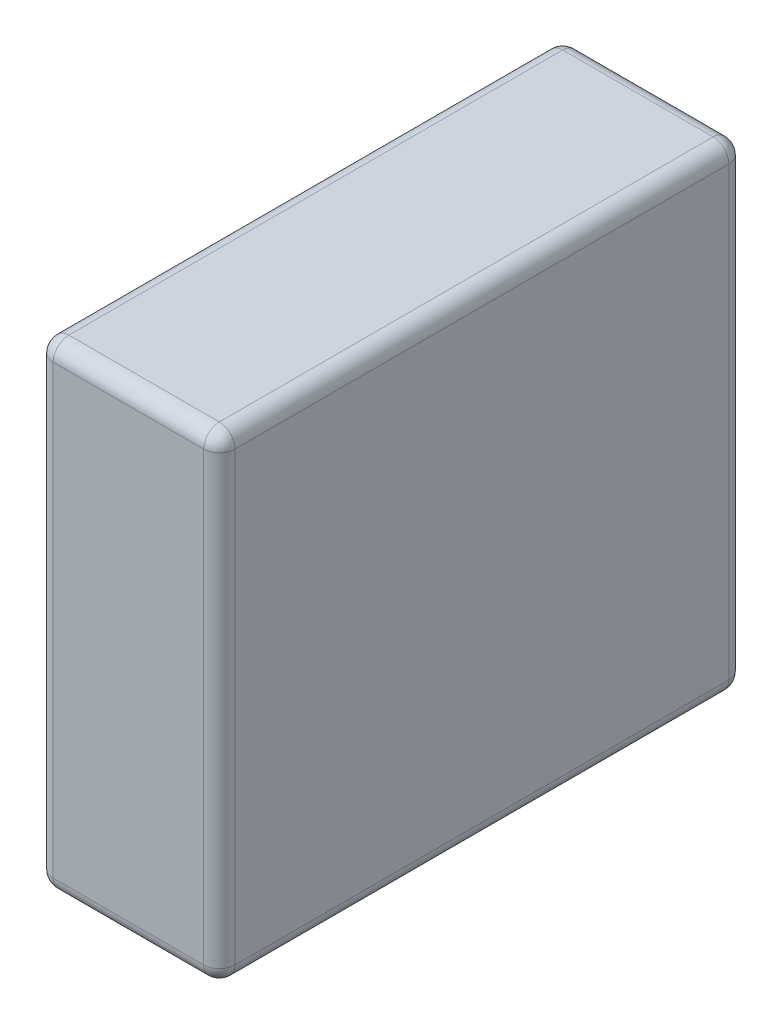
ISO-10303-21;
HEADER;
FILE_DESCRIPTION(('STEP AP214'),'2;1');
FILE_NAME('part.step','',(''),(''),'','','');
FILE_SCHEMA(('AUTOMOTIVE_DESIGN { 1 0 10303 214 1 1 1 1 }'));
ENDSEC;
DATA;
#1=APPLICATION_CONTEXT('core data for automotive mechanical design processes');
#2=APPLICATION_PROTOCOL_DEFINITION('international standard','automotive_design',2000,#1);
#3=PRODUCT_CONTEXT('',#1,'mechanical');
#4=PRODUCT('Part','Part','',(#3));
#5=PRODUCT_RELATED_PRODUCT_CATEGORY('part','',(#4));
#6=PRODUCT_DEFINITION_FORMATION('','',#4);
#7=PRODUCT_DEFINITION_CONTEXT('part definition',#1,'design');
#8=PRODUCT_DEFINITION('design','',#6,#7);
#9=PRODUCT_DEFINITION_SHAPE('','',#8);
#10=(LENGTH_UNIT() NAMED_UNIT(*) SI_UNIT(.MILLI.,.METRE.));
#11=(NAMED_UNIT(*) PLANE_ANGLE_UNIT() SI_UNIT($,.RADIAN.));
#12=(NAMED_UNIT(*) SI_UNIT($,.STERADIAN.) SOLID_ANGLE_UNIT());
#13=UNCERTAINTY_MEASURE_WITH_UNIT(LENGTH_MEASURE(1.E-05),#10,'distance_accuracy_value','');
#14=(GEOMETRIC_REPRESENTATION_CONTEXT(3) GLOBAL_UNCERTAINTY_ASSIGNED_CONTEXT((#13)) GLOBAL_UNIT_ASSIGNED_CONTEXT((#10,
#11,#12)) REPRESENTATION_CONTEXT('',''));
#15=CARTESIAN_POINT('',(0.,0.,0.));
#16=DIRECTION('',(0.,0.,1.));
#17=DIRECTION('',(1.,0.,0.));
#18=AXIS2_PLACEMENT_3D('',#15,#16,#17);
#19=CARTESIAN_POINT('',(11.6,-30.5,-33.5));
#20=DIRECTION('',(1.,0.,0.));
#21=DIRECTION('',(0.,0.,-1.));
#22=AXIS2_PLACEMENT_3D('',#19,#20,#21);
#23=PLANE('',#22);
#24=DIRECTION('',(0.,0.,-1.));
#25=VECTOR('',#24,1.);
#26=CARTESIAN_POINT('',(11.6,-28.5,-33.5));
#27=LINE('',#26,#25);
#28=CARTESIAN_POINT('',(11.6,-28.5,31.5));
#29=VERTEX_POINT('',#28);
#30=CARTESIAN_POINT('',(11.6,-28.5,-31.5));
#31=VERTEX_POINT('',#30);
#32=EDGE_CURVE('E199',#29,#31,#27,.T.);
#33=ORIENTED_EDGE('',*,*,#32,.T.);
#34=DIRECTION('',(0.,1.,0.));
#35=VECTOR('',#34,1.);
#36=CARTESIAN_POINT('',(11.6,-30.5,-31.5));
#37=LINE('',#36,#35);
#38=CARTESIAN_POINT('',(11.6,28.5,-31.5));
#39=VERTEX_POINT('',#38);
#40=EDGE_CURVE('E202',#31,#39,#37,.T.);
#41=ORIENTED_EDGE('',*,*,#40,.T.);
#42=DIRECTION('',(0.,0.,-1.));
#43=VECTOR('',#42,1.);
#44=CARTESIAN_POINT('',(11.6,28.5,-33.5));
#45=LINE('',#44,#43);
#46=CARTESIAN_POINT('',(11.6,28.5,31.5));
#47=VERTEX_POINT('',#46);
#48=EDGE_CURVE('E197',#39,#47,#45,.F.);
#49=ORIENTED_EDGE('',*,*,#48,.T.);
#50=DIRECTION('',(0.,1.,0.));
#51=VECTOR('',#50,1.);
#52=CARTESIAN_POINT('',(11.6,-30.5,31.5));
#53=LINE('',#52,#51);
#54=EDGE_CURVE('E195',#47,#29,#53,.F.);
#55=ORIENTED_EDGE('',*,*,#54,.T.);
#56=EDGE_LOOP('',(#33,#41,#49,#55));
#57=FACE_BOUND('',#56,.T.);
#58=ADVANCED_FACE('F38',(#57),#23,.T.);
#59=CARTESIAN_POINT('',(-11.6,-30.5,33.5));
#60=DIRECTION('',(0.,0.,1.));
#61=DIRECTION('',(1.,0.,0.));
#62=AXIS2_PLACEMENT_3D('',#59,#60,#61);
#63=PLANE('',#62);
#64=DIRECTION('',(0.,1.,0.));
#65=VECTOR('',#64,1.);
#66=CARTESIAN_POINT('',(-9.6,-30.5,33.5));
#67=LINE('',#66,#65);
#68=CARTESIAN_POINT('',(-9.6,28.5,33.5));
#69=VERTEX_POINT('',#68);
#70=CARTESIAN_POINT('',(-9.6,-28.5,33.5));
#71=VERTEX_POINT('',#70);
#72=EDGE_CURVE('E47',#69,#71,#67,.F.);
#73=ORIENTED_EDGE('',*,*,#72,.T.);
#74=DIRECTION('',(1.,0.,0.));
#75=VECTOR('',#74,1.);
#76=CARTESIAN_POINT('',(11.6,-28.5,33.5));
#77=LINE('',#76,#75);
#78=CARTESIAN_POINT('',(9.6,-28.5,33.5));
#79=VERTEX_POINT('',#78);
#80=EDGE_CURVE('E11',#71,#79,#77,.T.);
#81=ORIENTED_EDGE('',*,*,#80,.T.);
#82=DIRECTION('',(0.,1.,0.));
#83=VECTOR('',#82,1.);
#84=CARTESIAN_POINT('',(9.6,-30.5,33.5));
#85=LINE('',#84,#83);
#86=CARTESIAN_POINT('',(9.6,28.5,33.5));
#87=VERTEX_POINT('',#86);
#88=EDGE_CURVE('E204',#79,#87,#85,.T.);
#89=ORIENTED_EDGE('',*,*,#88,.T.);
#90=DIRECTION('',(1.,0.,0.));
#91=VECTOR('',#90,1.);
#92=CARTESIAN_POINT('',(-11.6,28.5,33.5));
#93=LINE('',#92,#91);
#94=EDGE_CURVE('E58',#87,#69,#93,.F.);
#95=ORIENTED_EDGE('',*,*,#94,.T.);
#96=EDGE_LOOP('',(#73,#81,#89,#95));
#97=FACE_BOUND('',#96,.T.);
#98=ADVANCED_FACE('F285',(#97),#63,.T.);
#99=CARTESIAN_POINT('',(-11.6,-30.5,-33.5));
#100=DIRECTION('',(-1.,0.,0.));
#101=DIRECTION('',(0.,0.,1.));
#102=AXIS2_PLACEMENT_3D('',#99,#100,#101);
#103=PLANE('',#102);
#104=DIRECTION('',(0.,1.,0.));
#105=VECTOR('',#104,1.);
#106=CARTESIAN_POINT('',(-11.6,-30.5,-31.5));
#107=LINE('',#106,#105);
#108=CARTESIAN_POINT('',(-11.6,28.5,-31.5));
#109=VERTEX_POINT('',#108);
#110=CARTESIAN_POINT('',(-11.6,-28.5,-31.5));
#111=VERTEX_POINT('',#110);
#112=EDGE_CURVE('E190',#109,#111,#107,.F.);
#113=ORIENTED_EDGE('',*,*,#112,.T.);
#114=DIRECTION('',(0.,0.,1.));
#115=VECTOR('',#114,1.);
#116=CARTESIAN_POINT('',(-11.6,-28.5,33.5));
#117=LINE('',#116,#115);
#118=CARTESIAN_POINT('',(-11.6,-28.5,31.5));
#119=VERTEX_POINT('',#118);
#120=EDGE_CURVE('E192',#111,#119,#117,.T.);
#121=ORIENTED_EDGE('',*,*,#120,.T.);
#122=DIRECTION('',(0.,1.,0.));
#123=VECTOR('',#122,1.);
#124=CARTESIAN_POINT('',(-11.6,-30.5,31.5));
#125=LINE('',#124,#123);
#126=CARTESIAN_POINT('',(-11.6,28.5,31.5));
#127=VERTEX_POINT('',#126);
#128=EDGE_CURVE('E186',#119,#127,#125,.T.);
#129=ORIENTED_EDGE('',*,*,#128,.T.);
#130=DIRECTION('',(0.,0.,1.));
#131=VECTOR('',#130,1.);
#132=CARTESIAN_POINT('',(-11.6,28.5,-33.5));
#133=LINE('',#132,#131);
#134=EDGE_CURVE('E188',#127,#109,#133,.F.);
#135=ORIENTED_EDGE('',*,*,#134,.T.);
#136=EDGE_LOOP('',(#113,#121,#129,#135));
#137=FACE_BOUND('',#136,.T.);
#138=ADVANCED_FACE('F268',(#137),#103,.T.);
#139=CARTESIAN_POINT('',(-11.6,-30.5,-33.5));
#140=DIRECTION('',(0.,0.,-1.));
#141=DIRECTION('',(-1.,0.,0.));
#142=AXIS2_PLACEMENT_3D('',#139,#140,#141);
#143=PLANE('',#142);
#144=DIRECTION('',(-1.,0.,0.));
#145=VECTOR('',#144,1.);
#146=CARTESIAN_POINT('',(-11.6,-28.5,-33.5));
#147=LINE('',#146,#145);
#148=CARTESIAN_POINT('',(9.6,-28.5,-33.5));
#149=VERTEX_POINT('',#148);
#150=CARTESIAN_POINT('',(-9.6,-28.5,-33.5));
#151=VERTEX_POINT('',#150);
#152=EDGE_CURVE('E138',#149,#151,#147,.T.);
#153=ORIENTED_EDGE('',*,*,#152,.T.);
#154=DIRECTION('',(0.,1.,0.));
#155=VECTOR('',#154,1.);
#156=CARTESIAN_POINT('',(-9.6,-30.5,-33.5));
#157=LINE('',#156,#155);
#158=CARTESIAN_POINT('',(-9.6,28.5,-33.5));
#159=VERTEX_POINT('',#158);
#160=EDGE_CURVE('E134',#151,#159,#157,.T.);
#161=ORIENTED_EDGE('',*,*,#160,.T.);
#162=DIRECTION('',(-1.,0.,0.));
#163=VECTOR('',#162,1.);
#164=CARTESIAN_POINT('',(-11.6,28.5,-33.5));
#165=LINE('',#164,#163);
#166=CARTESIAN_POINT('',(9.6,28.5,-33.5));
#167=VERTEX_POINT('',#166);
#168=EDGE_CURVE('E126',#159,#167,#165,.F.);
#169=ORIENTED_EDGE('',*,*,#168,.T.);
#170=DIRECTION('',(0.,1.,0.));
#171=VECTOR('',#170,1.);
#172=CARTESIAN_POINT('',(9.59999999999999,-30.5,-33.5));
#173=LINE('',#172,#171);
#174=EDGE_CURVE('E131',#167,#149,#173,.F.);
#175=ORIENTED_EDGE('',*,*,#174,.T.);
#176=EDGE_LOOP('',(#153,#161,#169,#175));
#177=FACE_BOUND('',#176,.T.);
#178=ADVANCED_FACE('F129',(#177),#143,.T.);
#179=CARTESIAN_POINT('',(0.,-30.5,0.));
#180=DIRECTION('',(0.,1.,0.));
#181=DIRECTION('',(0.,0.,1.));
#182=AXIS2_PLACEMENT_3D('',#179,#180,#181);
#183=PLANE('',#182);
#184=DIRECTION('',(0.,0.,1.));
#185=VECTOR('',#184,1.);
#186=CARTESIAN_POINT('',(-9.6,-30.5,-33.5));
#187=LINE('',#186,#185);
#188=CARTESIAN_POINT('',(-9.6,-30.5,31.5));
#189=VERTEX_POINT('',#188);
#190=CARTESIAN_POINT('',(-9.6,-30.5,-31.5));
#191=VERTEX_POINT('',#190);
#192=EDGE_CURVE('E174',#189,#191,#187,.F.);
#193=ORIENTED_EDGE('',*,*,#192,.T.);
#194=DIRECTION('',(-1.,0.,0.));
#195=VECTOR('',#194,1.);
#196=CARTESIAN_POINT('',(11.6,-30.5,-31.5));
#197=LINE('',#196,#195);
#198=CARTESIAN_POINT('',(9.6,-30.5,-31.5));
#199=VERTEX_POINT('',#198);
#200=EDGE_CURVE('E176',#191,#199,#197,.F.);
#201=ORIENTED_EDGE('',*,*,#200,.T.);
#202=DIRECTION('',(0.,0.,-1.));
#203=VECTOR('',#202,1.);
#204=CARTESIAN_POINT('',(9.6,-30.5,33.5));
#205=LINE('',#204,#203);
#206=CARTESIAN_POINT('',(9.6,-30.5,31.5));
#207=VERTEX_POINT('',#206);
#208=EDGE_CURVE('E172',#199,#207,#205,.F.);
#209=ORIENTED_EDGE('',*,*,#208,.T.);
#210=DIRECTION('',(1.,0.,0.));
#211=VECTOR('',#210,1.);
#212=CARTESIAN_POINT('',(-11.6,-30.5,31.5));
#213=LINE('',#212,#211);
#214=EDGE_CURVE('E170',#207,#189,#213,.F.);
#215=ORIENTED_EDGE('',*,*,#214,.T.);
#216=EDGE_LOOP('',(#193,#201,#209,#215));
#217=FACE_BOUND('',#216,.T.);
#218=ADVANCED_FACE('F305',(#217),#183,.F.);
#219=CARTESIAN_POINT('',(0.,30.5,0.));
#220=DIRECTION('',(0.,1.,0.));
#221=DIRECTION('',(0.,0.,1.));
#222=AXIS2_PLACEMENT_3D('',#219,#220,#221);
#223=PLANE('',#222);
#224=DIRECTION('',(0.,0.,-1.));
#225=VECTOR('',#224,1.);
#226=CARTESIAN_POINT('',(9.6,30.5,0.));
#227=LINE('',#226,#225);
#228=CARTESIAN_POINT('',(9.6,30.5,31.5));
#229=VERTEX_POINT('',#228);
#230=CARTESIAN_POINT('',(9.6,30.5,-31.5));
#231=VERTEX_POINT('',#230);
#232=EDGE_CURVE('E181',#229,#231,#227,.T.);
#233=ORIENTED_EDGE('',*,*,#232,.T.);
#234=DIRECTION('',(-1.,0.,0.));
#235=VECTOR('',#234,1.);
#236=CARTESIAN_POINT('',(0.,30.5,-31.5));
#237=LINE('',#236,#235);
#238=CARTESIAN_POINT('',(-9.6,30.5,-31.5));
#239=VERTEX_POINT('',#238);
#240=EDGE_CURVE('E146',#231,#239,#237,.T.);
#241=ORIENTED_EDGE('',*,*,#240,.T.);
#242=DIRECTION('',(0.,0.,1.));
#243=VECTOR('',#242,1.);
#244=CARTESIAN_POINT('',(-9.6,30.5,0.));
#245=LINE('',#244,#243);
#246=CARTESIAN_POINT('',(-9.6,30.5,31.5));
#247=VERTEX_POINT('',#246);
#248=EDGE_CURVE('E183',#239,#247,#245,.T.);
#249=ORIENTED_EDGE('',*,*,#248,.T.);
#250=DIRECTION('',(1.,0.,0.));
#251=VECTOR('',#250,1.);
#252=CARTESIAN_POINT('',(0.,30.5,31.5));
#253=LINE('',#252,#251);
#254=EDGE_CURVE('E179',#247,#229,#253,.T.);
#255=ORIENTED_EDGE('',*,*,#254,.T.);
#256=EDGE_LOOP('',(#233,#241,#249,#255));
#257=FACE_BOUND('',#256,.T.);
#258=ADVANCED_FACE('F303',(#257),#223,.T.);
#259=CARTESIAN_POINT('',(0.,28.5,31.5));
#260=DIRECTION('',(1.,0.,0.));
#261=DIRECTION('',(0.,0.,-1.));
#262=AXIS2_PLACEMENT_3D('',#259,#260,#261);
#263=CYLINDRICAL_SURFACE('',#262,2.);
#264=CARTESIAN_POINT('',(9.6,28.5,31.5));
#265=DIRECTION('',(1.,0.,0.));
#266=DIRECTION('',(0.,0.,-1.));
#267=AXIS2_PLACEMENT_3D('',#264,#265,#266);
#268=CIRCLE('',#267,2.);
#269=EDGE_CURVE('E42',#229,#87,#268,.T.);
#270=ORIENTED_EDGE('',*,*,#269,.F.);
#271=ORIENTED_EDGE('',*,*,#254,.F.);
#272=CARTESIAN_POINT('',(-9.6,28.5,31.5));
#273=DIRECTION('',(-1.,0.,0.));
#274=DIRECTION('',(0.,0.,1.));
#275=AXIS2_PLACEMENT_3D('',#272,#273,#274);
#276=CIRCLE('',#275,2.);
#277=EDGE_CURVE('E166',#69,#247,#276,.T.);
#278=ORIENTED_EDGE('',*,*,#277,.F.);
#279=ORIENTED_EDGE('',*,*,#94,.F.);
#280=EDGE_LOOP('',(#270,#271,#278,#279));
#281=FACE_BOUND('',#280,.T.);
#282=ADVANCED_FACE('F40',(#281),#263,.T.);
#283=CARTESIAN_POINT('',(9.6,28.5,31.5));
#284=DIRECTION('',(0.,0.,1.));
#285=DIRECTION('',(1.,0.,0.));
#286=AXIS2_PLACEMENT_3D('',#283,#284,#285);
#287=SPHERICAL_SURFACE('',#286,2.);
#288=CARTESIAN_POINT('',(9.6,28.5,31.5));
#289=DIRECTION('',(0.,0.,1.));
#290=DIRECTION('',(1.,0.,0.));
#291=AXIS2_PLACEMENT_3D('',#288,#289,#290);
#292=CIRCLE('',#291,2.);
#293=EDGE_CURVE('E249',#229,#47,#292,.F.);
#294=ORIENTED_EDGE('',*,*,#293,.F.);
#295=ORIENTED_EDGE('',*,*,#269,.T.);
#296=CARTESIAN_POINT('',(9.6,28.5,31.5));
#297=DIRECTION('',(0.,1.,0.));
#298=DIRECTION('',(0.,0.,1.));
#299=AXIS2_PLACEMENT_3D('',#296,#297,#298);
#300=CIRCLE('',#299,2.);
#301=EDGE_CURVE('E252',#47,#87,#300,.F.);
#302=ORIENTED_EDGE('',*,*,#301,.F.);
#303=EDGE_LOOP('',(#294,#295,#302));
#304=FACE_BOUND('',#303,.T.);
#305=ADVANCED_FACE('F292',(#304),#287,.T.);
#306=CARTESIAN_POINT('',(-9.6,28.5,31.5));
#307=DIRECTION('',(0.,0.,1.));
#308=DIRECTION('',(1.,0.,0.));
#309=AXIS2_PLACEMENT_3D('',#306,#307,#308);
#310=SPHERICAL_SURFACE('',#309,2.);
#311=CARTESIAN_POINT('',(-9.6,28.5,31.5));
#312=DIRECTION('',(0.,1.,0.));
#313=DIRECTION('',(0.,0.,1.));
#314=AXIS2_PLACEMENT_3D('',#311,#312,#313);
#315=CIRCLE('',#314,2.);
#316=EDGE_CURVE('E243',#69,#127,#315,.F.);
#317=ORIENTED_EDGE('',*,*,#316,.F.);
#318=ORIENTED_EDGE('',*,*,#277,.T.);
#319=CARTESIAN_POINT('',(-9.6,28.5,31.5));
#320=DIRECTION('',(0.,0.,1.));
#321=DIRECTION('',(1.,0.,0.));
#322=AXIS2_PLACEMENT_3D('',#319,#320,#321);
#323=CIRCLE('',#322,2.);
#324=EDGE_CURVE('E246',#127,#247,#323,.F.);
#325=ORIENTED_EDGE('',*,*,#324,.F.);
#326=EDGE_LOOP('',(#317,#318,#325));
#327=FACE_BOUND('',#326,.T.);
#328=ADVANCED_FACE('F258',(#327),#310,.T.);
#329=CARTESIAN_POINT('',(9.6,-30.5,31.5));
#330=DIRECTION('',(0.,1.,0.));
#331=DIRECTION('',(0.,0.,1.));
#332=AXIS2_PLACEMENT_3D('',#329,#330,#331);
#333=CYLINDRICAL_SURFACE('',#332,2.);
#334=ORIENTED_EDGE('',*,*,#301,.T.);
#335=ORIENTED_EDGE('',*,*,#88,.F.);
#336=CARTESIAN_POINT('',(9.6,-28.5,31.5));
#337=DIRECTION('',(0.,-1.,0.));
#338=DIRECTION('',(0.,0.,-1.));
#339=AXIS2_PLACEMENT_3D('',#336,#337,#338);
#340=CIRCLE('',#339,2.);
#341=EDGE_CURVE('E238',#29,#79,#340,.T.);
#342=ORIENTED_EDGE('',*,*,#341,.F.);
#343=ORIENTED_EDGE('',*,*,#54,.F.);
#344=EDGE_LOOP('',(#334,#335,#342,#343));
#345=FACE_BOUND('',#344,.T.);
#346=ADVANCED_FACE('F295',(#345),#333,.T.);
#347=CARTESIAN_POINT('',(9.6,28.5,0.));
#348=DIRECTION('',(0.,0.,-1.));
#349=DIRECTION('',(-1.,0.,0.));
#350=AXIS2_PLACEMENT_3D('',#347,#348,#349);
#351=CYLINDRICAL_SURFACE('',#350,2.);
#352=ORIENTED_EDGE('',*,*,#293,.T.);
#353=ORIENTED_EDGE('',*,*,#48,.F.);
#354=CARTESIAN_POINT('',(9.6,28.5,-31.5));
#355=DIRECTION('',(0.,0.,-1.));
#356=DIRECTION('',(-1.,0.,0.));
#357=AXIS2_PLACEMENT_3D('',#354,#355,#356);
#358=CIRCLE('',#357,2.);
#359=EDGE_CURVE('E150',#231,#39,#358,.T.);
#360=ORIENTED_EDGE('',*,*,#359,.F.);
#361=ORIENTED_EDGE('',*,*,#232,.F.);
#362=EDGE_LOOP('',(#352,#353,#360,#361));
#363=FACE_BOUND('',#362,.T.);
#364=ADVANCED_FACE('F301',(#363),#351,.T.);
#365=CARTESIAN_POINT('',(0.,28.5,-31.5));
#366=DIRECTION('',(-1.,0.,0.));
#367=DIRECTION('',(0.,0.,1.));
#368=AXIS2_PLACEMENT_3D('',#365,#366,#367);
#369=CYLINDRICAL_SURFACE('',#368,2.);
#370=CARTESIAN_POINT('',(-9.6,28.5,-31.5));
#371=DIRECTION('',(-1.,0.,0.));
#372=DIRECTION('',(0.,0.,1.));
#373=AXIS2_PLACEMENT_3D('',#370,#371,#372);
#374=CIRCLE('',#373,2.);
#375=EDGE_CURVE('E151',#239,#159,#374,.T.);
#376=ORIENTED_EDGE('',*,*,#375,.F.);
#377=ORIENTED_EDGE('',*,*,#240,.F.);
#378=CARTESIAN_POINT('',(9.6,28.5,-31.5));
#379=DIRECTION('',(1.,0.,0.));
#380=DIRECTION('',(0.,0.,-1.));
#381=AXIS2_PLACEMENT_3D('',#378,#379,#380);
#382=CIRCLE('',#381,2.);
#383=EDGE_CURVE('E142',#167,#231,#382,.T.);
#384=ORIENTED_EDGE('',*,*,#383,.F.);
#385=ORIENTED_EDGE('',*,*,#168,.F.);
#386=EDGE_LOOP('',(#376,#377,#384,#385));
#387=FACE_BOUND('',#386,.T.);
#388=ADVANCED_FACE('F144',(#387),#369,.T.);
#389=CARTESIAN_POINT('',(-9.6,28.5,0.));
#390=DIRECTION('',(0.,0.,1.));
#391=DIRECTION('',(1.,0.,0.));
#392=AXIS2_PLACEMENT_3D('',#389,#390,#391);
#393=CYLINDRICAL_SURFACE('',#392,2.);
#394=ORIENTED_EDGE('',*,*,#324,.T.);
#395=ORIENTED_EDGE('',*,*,#248,.F.);
#396=CARTESIAN_POINT('',(-9.6,28.5,-31.5));
#397=DIRECTION('',(0.,0.,-1.));
#398=DIRECTION('',(-1.,0.,0.));
#399=AXIS2_PLACEMENT_3D('',#396,#397,#398);
#400=CIRCLE('',#399,2.);
#401=EDGE_CURVE('E234',#109,#239,#400,.T.);
#402=ORIENTED_EDGE('',*,*,#401,.F.);
#403=ORIENTED_EDGE('',*,*,#134,.F.);
#404=EDGE_LOOP('',(#394,#395,#402,#403));
#405=FACE_BOUND('',#404,.T.);
#406=ADVANCED_FACE('F264',(#405),#393,.T.);
#407=CARTESIAN_POINT('',(-9.6,-30.5,31.5));
#408=DIRECTION('',(0.,1.,0.));
#409=DIRECTION('',(0.,0.,1.));
#410=AXIS2_PLACEMENT_3D('',#407,#408,#409);
#411=CYLINDRICAL_SURFACE('',#410,2.);
#412=ORIENTED_EDGE('',*,*,#316,.T.);
#413=ORIENTED_EDGE('',*,*,#128,.F.);
#414=CARTESIAN_POINT('',(-9.6,-28.5,31.5));
#415=DIRECTION('',(0.,-1.,0.));
#416=DIRECTION('',(0.,0.,-1.));
#417=AXIS2_PLACEMENT_3D('',#414,#415,#416);
#418=CIRCLE('',#417,2.);
#419=EDGE_CURVE('E231',#71,#119,#418,.T.);
#420=ORIENTED_EDGE('',*,*,#419,.F.);
#421=ORIENTED_EDGE('',*,*,#72,.F.);
#422=EDGE_LOOP('',(#412,#413,#420,#421));
#423=FACE_BOUND('',#422,.T.);
#424=ADVANCED_FACE('F274',(#423),#411,.T.);
#425=CARTESIAN_POINT('',(-11.6,-28.5,31.5));
#426=DIRECTION('',(-1.,0.,0.));
#427=DIRECTION('',(0.,0.,1.));
#428=AXIS2_PLACEMENT_3D('',#425,#426,#427);
#429=CYLINDRICAL_SURFACE('',#428,2.);
#430=CARTESIAN_POINT('',(9.6,-28.5,31.5));
#431=DIRECTION('',(1.,0.,0.));
#432=DIRECTION('',(0.,1.,0.));
#433=AXIS2_PLACEMENT_3D('',#430,#431,#432);
#434=CIRCLE('',#433,2.);
#435=EDGE_CURVE('E240',#79,#207,#434,.T.);
#436=ORIENTED_EDGE('',*,*,#435,.F.);
#437=ORIENTED_EDGE('',*,*,#80,.F.);
#438=CARTESIAN_POINT('',(-9.6,-28.5,31.5));
#439=DIRECTION('',(-1.,0.,0.));
#440=DIRECTION('',(0.,0.,1.));
#441=AXIS2_PLACEMENT_3D('',#438,#439,#440);
#442=CIRCLE('',#441,2.);
#443=EDGE_CURVE('E228',#189,#71,#442,.T.);
#444=ORIENTED_EDGE('',*,*,#443,.F.);
#445=ORIENTED_EDGE('',*,*,#214,.F.);
#446=EDGE_LOOP('',(#436,#437,#444,#445));
#447=FACE_BOUND('',#446,.T.);
#448=ADVANCED_FACE('F283',(#447),#429,.T.);
#449=CARTESIAN_POINT('',(9.6,-28.5,31.5));
#450=DIRECTION('',(0.,0.,1.));
#451=DIRECTION('',(1.,0.,0.));
#452=AXIS2_PLACEMENT_3D('',#449,#450,#451);
#453=SPHERICAL_SURFACE('',#452,2.);
#454=ORIENTED_EDGE('',*,*,#341,.T.);
#455=ORIENTED_EDGE('',*,*,#435,.T.);
#456=CARTESIAN_POINT('',(9.6,-28.5,31.5));
#457=DIRECTION('',(0.,0.,1.));
#458=DIRECTION('',(1.,0.,0.));
#459=AXIS2_PLACEMENT_3D('',#456,#457,#458);
#460=CIRCLE('',#459,2.);
#461=EDGE_CURVE('E158',#29,#207,#460,.F.);
#462=ORIENTED_EDGE('',*,*,#461,.F.);
#463=EDGE_LOOP('',(#454,#455,#462));
#464=FACE_BOUND('',#463,.T.);
#465=ADVANCED_FACE('F356',(#464),#453,.T.);
#466=CARTESIAN_POINT('',(9.6,28.5,-31.5));
#467=DIRECTION('',(0.,0.,1.));
#468=DIRECTION('',(1.,0.,0.));
#469=AXIS2_PLACEMENT_3D('',#466,#467,#468);
#470=SPHERICAL_SURFACE('',#469,2.);
#471=ORIENTED_EDGE('',*,*,#383,.T.);
#472=ORIENTED_EDGE('',*,*,#359,.T.);
#473=CARTESIAN_POINT('',(9.6,28.5,-31.5));
#474=DIRECTION('',(0.,1.,0.));
#475=DIRECTION('',(0.,0.,1.));
#476=AXIS2_PLACEMENT_3D('',#473,#474,#475);
#477=CIRCLE('',#476,2.);
#478=EDGE_CURVE('E154',#167,#39,#477,.F.);
#479=ORIENTED_EDGE('',*,*,#478,.F.);
#480=EDGE_LOOP('',(#471,#472,#479));
#481=FACE_BOUND('',#480,.T.);
#482=ADVANCED_FACE('F155',(#481),#470,.T.);
#483=CARTESIAN_POINT('',(-9.6,28.5,-31.5));
#484=DIRECTION('',(0.,0.,1.));
#485=DIRECTION('',(1.,0.,0.));
#486=AXIS2_PLACEMENT_3D('',#483,#484,#485);
#487=SPHERICAL_SURFACE('',#486,2.);
#488=ORIENTED_EDGE('',*,*,#401,.T.);
#489=ORIENTED_EDGE('',*,*,#375,.T.);
#490=CARTESIAN_POINT('',(-9.6,28.5,-31.5));
#491=DIRECTION('',(0.,1.,0.));
#492=DIRECTION('',(0.,0.,1.));
#493=AXIS2_PLACEMENT_3D('',#490,#491,#492);
#494=CIRCLE('',#493,2.);
#495=EDGE_CURVE('E159',#109,#159,#494,.F.);
#496=ORIENTED_EDGE('',*,*,#495,.F.);
#497=EDGE_LOOP('',(#488,#489,#496));
#498=FACE_BOUND('',#497,.T.);
#499=ADVANCED_FACE('F350',(#498),#487,.T.);
#500=CARTESIAN_POINT('',(-9.6,-28.5,31.5));
#501=DIRECTION('',(0.,0.,1.));
#502=DIRECTION('',(1.,0.,0.));
#503=AXIS2_PLACEMENT_3D('',#500,#501,#502);
#504=SPHERICAL_SURFACE('',#503,2.);
#505=ORIENTED_EDGE('',*,*,#443,.T.);
#506=ORIENTED_EDGE('',*,*,#419,.T.);
#507=CARTESIAN_POINT('',(-9.6,-28.5,31.5));
#508=DIRECTION('',(0.,0.,1.));
#509=DIRECTION('',(0.,-1.,0.));
#510=AXIS2_PLACEMENT_3D('',#507,#508,#509);
#511=CIRCLE('',#510,2.);
#512=EDGE_CURVE('E222',#189,#119,#511,.F.);
#513=ORIENTED_EDGE('',*,*,#512,.F.);
#514=EDGE_LOOP('',(#505,#506,#513));
#515=FACE_BOUND('',#514,.T.);
#516=ADVANCED_FACE('F278',(#515),#504,.T.);
#517=CARTESIAN_POINT('',(9.6,-28.5,-33.5));
#518=DIRECTION('',(0.,0.,1.));
#519=DIRECTION('',(1.,0.,0.));
#520=AXIS2_PLACEMENT_3D('',#517,#518,#519);
#521=CYLINDRICAL_SURFACE('',#520,2.);
#522=ORIENTED_EDGE('',*,*,#461,.T.);
#523=ORIENTED_EDGE('',*,*,#208,.F.);
#524=CARTESIAN_POINT('',(9.6,-28.5,-31.5));
#525=DIRECTION('',(0.,0.,-1.));
#526=DIRECTION('',(-1.,0.,0.));
#527=AXIS2_PLACEMENT_3D('',#524,#525,#526);
#528=CIRCLE('',#527,2.);
#529=EDGE_CURVE('E219',#31,#199,#528,.T.);
#530=ORIENTED_EDGE('',*,*,#529,.F.);
#531=ORIENTED_EDGE('',*,*,#32,.F.);
#532=EDGE_LOOP('',(#522,#523,#530,#531));
#533=FACE_BOUND('',#532,.T.);
#534=ADVANCED_FACE('F344',(#533),#521,.T.);
#535=CARTESIAN_POINT('',(9.6,-30.5,-31.5));
#536=DIRECTION('',(0.,1.,0.));
#537=DIRECTION('',(0.,0.,1.));
#538=AXIS2_PLACEMENT_3D('',#535,#536,#537);
#539=CYLINDRICAL_SURFACE('',#538,2.);
#540=ORIENTED_EDGE('',*,*,#478,.T.);
#541=ORIENTED_EDGE('',*,*,#40,.F.);
#542=CARTESIAN_POINT('',(9.6,-28.5,-31.5));
#543=DIRECTION('',(0.,-1.,0.));
#544=DIRECTION('',(0.,0.,-1.));
#545=AXIS2_PLACEMENT_3D('',#542,#543,#544);
#546=CIRCLE('',#545,2.);
#547=EDGE_CURVE('E162',#149,#31,#546,.T.);
#548=ORIENTED_EDGE('',*,*,#547,.F.);
#549=ORIENTED_EDGE('',*,*,#174,.F.);
#550=EDGE_LOOP('',(#540,#541,#548,#549));
#551=FACE_BOUND('',#550,.T.);
#552=ADVANCED_FACE('F161',(#551),#539,.T.);
#553=CARTESIAN_POINT('',(-9.6,-30.5,-31.5));
#554=DIRECTION('',(0.,1.,0.));
#555=DIRECTION('',(0.,0.,1.));
#556=AXIS2_PLACEMENT_3D('',#553,#554,#555);
#557=CYLINDRICAL_SURFACE('',#556,2.);
#558=ORIENTED_EDGE('',*,*,#495,.T.);
#559=ORIENTED_EDGE('',*,*,#160,.F.);
#560=CARTESIAN_POINT('',(-9.6,-28.5,-31.5));
#561=DIRECTION('',(0.,-1.,0.));
#562=DIRECTION('',(0.,0.,-1.));
#563=AXIS2_PLACEMENT_3D('',#560,#561,#562);
#564=CIRCLE('',#563,2.);
#565=EDGE_CURVE('E215',#111,#151,#564,.T.);
#566=ORIENTED_EDGE('',*,*,#565,.F.);
#567=ORIENTED_EDGE('',*,*,#112,.F.);
#568=EDGE_LOOP('',(#558,#559,#566,#567));
#569=FACE_BOUND('',#568,.T.);
#570=ADVANCED_FACE('F337',(#569),#557,.T.);
#571=CARTESIAN_POINT('',(-9.6,-28.5,-33.5));
#572=DIRECTION('',(0.,0.,-1.));
#573=DIRECTION('',(-1.,0.,0.));
#574=AXIS2_PLACEMENT_3D('',#571,#572,#573);
#575=CYLINDRICAL_SURFACE('',#574,2.);
#576=ORIENTED_EDGE('',*,*,#512,.T.);
#577=ORIENTED_EDGE('',*,*,#120,.F.);
#578=CARTESIAN_POINT('',(-9.6,-28.5,-31.5));
#579=DIRECTION('',(0.,0.,-1.));
#580=DIRECTION('',(-1.,0.,0.));
#581=AXIS2_PLACEMENT_3D('',#578,#579,#580);
#582=CIRCLE('',#581,2.);
#583=EDGE_CURVE('E212',#191,#111,#582,.T.);
#584=ORIENTED_EDGE('',*,*,#583,.F.);
#585=ORIENTED_EDGE('',*,*,#192,.F.);
#586=EDGE_LOOP('',(#576,#577,#584,#585));
#587=FACE_BOUND('',#586,.T.);
#588=ADVANCED_FACE('F333',(#587),#575,.T.);
#589=CARTESIAN_POINT('',(9.6,-28.5,-31.5));
#590=DIRECTION('',(0.,0.,1.));
#591=DIRECTION('',(1.,0.,0.));
#592=AXIS2_PLACEMENT_3D('',#589,#590,#591);
#593=SPHERICAL_SURFACE('',#592,2.);
#594=ORIENTED_EDGE('',*,*,#547,.T.);
#595=ORIENTED_EDGE('',*,*,#529,.T.);
#596=CARTESIAN_POINT('',(9.6,-28.5,-31.5));
#597=DIRECTION('',(1.,0.,0.));
#598=DIRECTION('',(0.,0.,-1.));
#599=AXIS2_PLACEMENT_3D('',#596,#597,#598);
#600=CIRCLE('',#599,2.);
#601=EDGE_CURVE('E210',#149,#199,#600,.F.);
#602=ORIENTED_EDGE('',*,*,#601,.F.);
#603=EDGE_LOOP('',(#594,#595,#602));
#604=FACE_BOUND('',#603,.T.);
#605=ADVANCED_FACE('F329',(#604),#593,.T.);
#606=CARTESIAN_POINT('',(-9.6,-28.5,-31.5));
#607=DIRECTION('',(0.,0.,1.));
#608=DIRECTION('',(1.,0.,0.));
#609=AXIS2_PLACEMENT_3D('',#606,#607,#608);
#610=SPHERICAL_SURFACE('',#609,2.);
#611=ORIENTED_EDGE('',*,*,#583,.T.);
#612=ORIENTED_EDGE('',*,*,#565,.T.);
#613=CARTESIAN_POINT('',(-9.6,-28.5,-31.5));
#614=DIRECTION('',(-1.,0.,0.));
#615=DIRECTION('',(0.,0.,1.));
#616=AXIS2_PLACEMENT_3D('',#613,#614,#615);
#617=CIRCLE('',#616,2.);
#618=EDGE_CURVE('E208',#191,#151,#617,.F.);
#619=ORIENTED_EDGE('',*,*,#618,.F.);
#620=EDGE_LOOP('',(#611,#612,#619));
#621=FACE_BOUND('',#620,.T.);
#622=ADVANCED_FACE('F325',(#621),#610,.T.);
#623=CARTESIAN_POINT('',(-11.6,-28.5,-31.5));
#624=DIRECTION('',(1.,0.,0.));
#625=DIRECTION('',(0.,0.,-1.));
#626=AXIS2_PLACEMENT_3D('',#623,#624,#625);
#627=CYLINDRICAL_SURFACE('',#626,2.);
#628=ORIENTED_EDGE('',*,*,#601,.T.);
#629=ORIENTED_EDGE('',*,*,#200,.F.);
#630=ORIENTED_EDGE('',*,*,#618,.T.);
#631=ORIENTED_EDGE('',*,*,#152,.F.);
#632=EDGE_LOOP('',(#628,#629,#630,#631));
#633=FACE_BOUND('',#632,.T.);
#634=ADVANCED_FACE('F322',(#633),#627,.T.);
#635=CLOSED_SHELL('',(#58,#98,#138,#178,#218,#258,#282,#305,#328,#346,#364,#388,#406,#424,#448,
#465,#482,#499,#516,#534,#552,#570,#588,#605,#622,#634));
#636=MANIFOLD_SOLID_BREP('B2',#635);
#637=ADVANCED_BREP_SHAPE_REPRESENTATION('',(#18,#636),#14);
#638=SHAPE_DEFINITION_REPRESENTATION(#9,#637);
ENDSEC;
END-ISO-10303-21;
